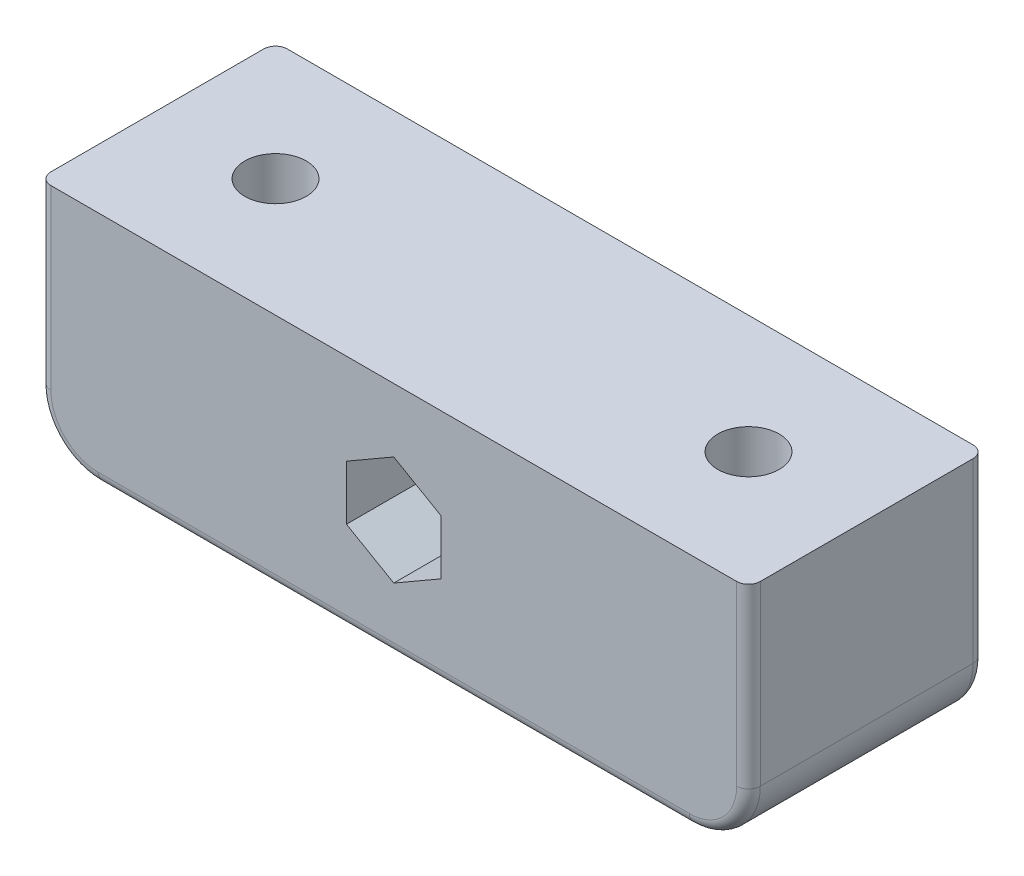
ISO-10303-21;
HEADER;
FILE_DESCRIPTION(('STEP AP214'),'2;1');
FILE_NAME('part.step','',(''),(''),'','','');
FILE_SCHEMA(('AUTOMOTIVE_DESIGN { 1 0 10303 214 1 1 1 1 }'));
ENDSEC;
DATA;
#1=APPLICATION_CONTEXT('core data for automotive mechanical design processes');
#2=APPLICATION_PROTOCOL_DEFINITION('international standard','automotive_design',2000,#1);
#3=PRODUCT_CONTEXT('',#1,'mechanical');
#4=PRODUCT('Part','Part','',(#3));
#5=PRODUCT_RELATED_PRODUCT_CATEGORY('part','',(#4));
#6=PRODUCT_DEFINITION_FORMATION('','',#4);
#7=PRODUCT_DEFINITION_CONTEXT('part definition',#1,'design');
#8=PRODUCT_DEFINITION('design','',#6,#7);
#9=PRODUCT_DEFINITION_SHAPE('','',#8);
#10=(LENGTH_UNIT() NAMED_UNIT(*) SI_UNIT(.MILLI.,.METRE.));
#11=(NAMED_UNIT(*) PLANE_ANGLE_UNIT() SI_UNIT($,.RADIAN.));
#12=(NAMED_UNIT(*) SI_UNIT($,.STERADIAN.) SOLID_ANGLE_UNIT());
#13=UNCERTAINTY_MEASURE_WITH_UNIT(LENGTH_MEASURE(1.E-05),#10,'distance_accuracy_value','');
#14=(GEOMETRIC_REPRESENTATION_CONTEXT(3) GLOBAL_UNCERTAINTY_ASSIGNED_CONTEXT((#13)) GLOBAL_UNIT_ASSIGNED_CONTEXT((#10,
#11,#12)) REPRESENTATION_CONTEXT('',''));
#15=CARTESIAN_POINT('',(0.,0.,0.));
#16=DIRECTION('',(0.,0.,1.));
#17=DIRECTION('',(1.,0.,0.));
#18=AXIS2_PLACEMENT_3D('',#15,#16,#17);
#19=CARTESIAN_POINT('',(0.,-10.,20.));
#20=DIRECTION('',(0.,0.,-1.));
#21=DIRECTION('',(-1.,0.,0.));
#22=AXIS2_PLACEMENT_3D('',#19,#20,#21);
#23=CYLINDRICAL_SURFACE('',#22,2.6);
#24=CARTESIAN_POINT('',(0.,-10.,3.));
#25=DIRECTION('',(0.,0.,-1.));
#26=DIRECTION('',(-1.,0.,0.));
#27=AXIS2_PLACEMENT_3D('',#24,#25,#26);
#28=CIRCLE('',#27,2.6);
#29=CARTESIAN_POINT('',(-2.6,-10.,3.));
#30=VERTEX_POINT('',#29);
#31=EDGE_CURVE('E295',#30,#30,#28,.T.);
#32=ORIENTED_EDGE('',*,*,#31,.T.);
#33=EDGE_LOOP('',(#32));
#34=FACE_BOUND('',#33,.T.);
#35=CARTESIAN_POINT('',(0.,-10.,12.));
#36=DIRECTION('',(0.,0.,1.));
#37=DIRECTION('',(1.,0.,0.));
#38=AXIS2_PLACEMENT_3D('',#35,#36,#37);
#39=CIRCLE('',#38,2.6);
#40=CARTESIAN_POINT('',(2.6,-10.,12.));
#41=VERTEX_POINT('',#40);
#42=EDGE_CURVE('E249',#41,#41,#39,.T.);
#43=ORIENTED_EDGE('',*,*,#42,.T.);
#44=EDGE_LOOP('',(#43));
#45=FACE_BOUND('',#44,.T.);
#46=ADVANCED_FACE('F33',(#34,#45),#23,.F.);
#47=CARTESIAN_POINT('',(-25.,-15.,20.));
#48=DIRECTION('',(0.,0.,-1.));
#49=DIRECTION('',(-1.,0.,0.));
#50=AXIS2_PLACEMENT_3D('',#47,#48,#49);
#51=PLANE('',#50);
#52=DIRECTION('',(-1.,0.,0.));
#53=VECTOR('',#52,1.);
#54=CARTESIAN_POINT('',(-30.,0.,20.));
#55=LINE('',#54,#53);
#56=CARTESIAN_POINT('',(29.,0.,20.));
#57=VERTEX_POINT('',#56);
#58=CARTESIAN_POINT('',(-29.,0.,20.));
#59=VERTEX_POINT('',#58);
#60=EDGE_CURVE('E319',#57,#59,#55,.T.);
#61=ORIENTED_EDGE('',*,*,#60,.T.);
#62=DIRECTION('',(0.,-1.,0.));
#63=VECTOR('',#62,1.);
#64=CARTESIAN_POINT('',(-29.,-15.,20.));
#65=LINE('',#64,#63);
#66=CARTESIAN_POINT('',(-29.,-15.,20.));
#67=VERTEX_POINT('',#66);
#68=EDGE_CURVE('E388',#59,#67,#65,.T.);
#69=ORIENTED_EDGE('',*,*,#68,.T.);
#70=CARTESIAN_POINT('',(-25.,-15.,20.));
#71=DIRECTION('',(0.,0.,-1.));
#72=DIRECTION('',(-1.,0.,0.));
#73=AXIS2_PLACEMENT_3D('',#70,#71,#72);
#74=CIRCLE('',#73,4.);
#75=CARTESIAN_POINT('',(-25.,-19.,20.));
#76=VERTEX_POINT('',#75);
#77=EDGE_CURVE('E57',#67,#76,#74,.F.);
#78=ORIENTED_EDGE('',*,*,#77,.T.);
#79=DIRECTION('',(1.,0.,0.));
#80=VECTOR('',#79,1.);
#81=CARTESIAN_POINT('',(-25.,-19.,20.));
#82=LINE('',#81,#80);
#83=CARTESIAN_POINT('',(25.,-19.,20.));
#84=VERTEX_POINT('',#83);
#85=EDGE_CURVE('E385',#76,#84,#82,.T.);
#86=ORIENTED_EDGE('',*,*,#85,.T.);
#87=CARTESIAN_POINT('',(25.,-15.,20.));
#88=DIRECTION('',(0.,0.,-1.));
#89=DIRECTION('',(-1.,0.,0.));
#90=AXIS2_PLACEMENT_3D('',#87,#88,#89);
#91=CIRCLE('',#90,4.);
#92=CARTESIAN_POINT('',(29.,-15.,20.));
#93=VERTEX_POINT('',#92);
#94=EDGE_CURVE('E381',#84,#93,#91,.F.);
#95=ORIENTED_EDGE('',*,*,#94,.T.);
#96=DIRECTION('',(0.,1.,0.));
#97=VECTOR('',#96,1.);
#98=CARTESIAN_POINT('',(29.,-15.,20.));
#99=LINE('',#98,#97);
#100=EDGE_CURVE('E383',#93,#57,#99,.T.);
#101=ORIENTED_EDGE('',*,*,#100,.T.);
#102=EDGE_LOOP('',(#61,#69,#78,#86,#95,#101));
#103=FACE_BOUND('',#102,.T.);
#104=DIRECTION('',(0.,-1.,0.));
#105=VECTOR('',#104,1.);
#106=CARTESIAN_POINT('',(-4.,-7.6905989232415,20.));
#107=LINE('',#106,#105);
#108=CARTESIAN_POINT('',(-4.,-7.6905989232415,20.));
#109=VERTEX_POINT('',#108);
#110=CARTESIAN_POINT('',(-4.,-12.3094010767585,20.));
#111=VERTEX_POINT('',#110);
#112=EDGE_CURVE('E236',#109,#111,#107,.T.);
#113=ORIENTED_EDGE('',*,*,#112,.F.);
#114=DIRECTION('',(-0.866025403784439,-0.5,0.));
#115=VECTOR('',#114,1.);
#116=CARTESIAN_POINT('',(0.,-5.38119784648299,20.));
#117=LINE('',#116,#115);
#118=CARTESIAN_POINT('',(0.,-5.38119784648299,20.));
#119=VERTEX_POINT('',#118);
#120=EDGE_CURVE('E204',#119,#109,#117,.T.);
#121=ORIENTED_EDGE('',*,*,#120,.F.);
#122=DIRECTION('',(-0.866025403784439,0.5,0.));
#123=VECTOR('',#122,1.);
#124=CARTESIAN_POINT('',(4.00000000000001,-7.6905989232415,20.));
#125=LINE('',#124,#123);
#126=CARTESIAN_POINT('',(4.00000000000001,-7.6905989232415,20.));
#127=VERTEX_POINT('',#126);
#128=EDGE_CURVE('E222',#127,#119,#125,.T.);
#129=ORIENTED_EDGE('',*,*,#128,.F.);
#130=DIRECTION('',(0.,1.,0.));
#131=VECTOR('',#130,1.);
#132=CARTESIAN_POINT('',(4.00000000000001,-12.3094010767585,20.));
#133=LINE('',#132,#131);
#134=CARTESIAN_POINT('',(4.00000000000001,-12.3094010767585,20.));
#135=VERTEX_POINT('',#134);
#136=EDGE_CURVE('E225',#135,#127,#133,.T.);
#137=ORIENTED_EDGE('',*,*,#136,.F.);
#138=DIRECTION('',(0.866025403784438,0.5,0.));
#139=VECTOR('',#138,1.);
#140=CARTESIAN_POINT('',(0.,-14.618802153517,20.));
#141=LINE('',#140,#139);
#142=CARTESIAN_POINT('',(0.,-14.618802153517,20.));
#143=VERTEX_POINT('',#142);
#144=EDGE_CURVE('E242',#143,#135,#141,.T.);
#145=ORIENTED_EDGE('',*,*,#144,.F.);
#146=DIRECTION('',(0.866025403784439,-0.5,0.));
#147=VECTOR('',#146,1.);
#148=CARTESIAN_POINT('',(-4.,-12.3094010767585,20.));
#149=LINE('',#148,#147);
#150=EDGE_CURVE('E239',#111,#143,#149,.T.);
#151=ORIENTED_EDGE('',*,*,#150,.F.);
#152=EDGE_LOOP('',(#113,#121,#129,#137,#145,#151));
#153=FACE_BOUND('',#152,.T.);
#154=ADVANCED_FACE('F420',(#103,#153),#51,.F.);
#155=CARTESIAN_POINT('',(-25.,-15.,0.));
#156=DIRECTION('',(0.,0.,-1.));
#157=DIRECTION('',(-1.,0.,0.));
#158=AXIS2_PLACEMENT_3D('',#155,#156,#157);
#159=PLANE('',#158);
#160=DIRECTION('',(-0.499999999999999,0.866025403784439,0.));
#161=VECTOR('',#160,1.);
#162=CARTESIAN_POINT('',(-3.03108891324554,-15.25,0.));
#163=LINE('',#162,#161);
#164=CARTESIAN_POINT('',(-3.03108891324554,-15.25,0.));
#165=VERTEX_POINT('',#164);
#166=CARTESIAN_POINT('',(-6.06217782649106,-9.99999999999999,0.));
#167=VERTEX_POINT('',#166);
#168=EDGE_CURVE('E277',#165,#167,#163,.T.);
#169=ORIENTED_EDGE('',*,*,#168,.F.);
#170=DIRECTION('',(-1.,0.,0.));
#171=VECTOR('',#170,1.);
#172=CARTESIAN_POINT('',(3.03108891324553,-15.25,0.));
#173=LINE('',#172,#171);
#174=CARTESIAN_POINT('',(3.03108891324553,-15.25,0.));
#175=VERTEX_POINT('',#174);
#176=EDGE_CURVE('E261',#175,#165,#173,.T.);
#177=ORIENTED_EDGE('',*,*,#176,.F.);
#178=DIRECTION('',(-0.5,-0.866025403784438,0.));
#179=VECTOR('',#178,1.);
#180=CARTESIAN_POINT('',(6.06217782649107,-10.,0.));
#181=LINE('',#180,#179);
#182=CARTESIAN_POINT('',(6.06217782649107,-10.,0.));
#183=VERTEX_POINT('',#182);
#184=EDGE_CURVE('E288',#183,#175,#181,.T.);
#185=ORIENTED_EDGE('',*,*,#184,.F.);
#186=DIRECTION('',(0.499999999999999,-0.866025403784439,0.));
#187=VECTOR('',#186,1.);
#188=CARTESIAN_POINT('',(3.03108891324554,-4.75,0.));
#189=LINE('',#188,#187);
#190=CARTESIAN_POINT('',(3.03108891324554,-4.75,0.));
#191=VERTEX_POINT('',#190);
#192=EDGE_CURVE('E285',#191,#183,#189,.T.);
#193=ORIENTED_EDGE('',*,*,#192,.F.);
#194=DIRECTION('',(1.,0.,0.));
#195=VECTOR('',#194,1.);
#196=CARTESIAN_POINT('',(-3.03108891324553,-4.75,0.));
#197=LINE('',#196,#195);
#198=CARTESIAN_POINT('',(-3.03108891324553,-4.75,0.));
#199=VERTEX_POINT('',#198);
#200=EDGE_CURVE('E282',#199,#191,#197,.T.);
#201=ORIENTED_EDGE('',*,*,#200,.F.);
#202=DIRECTION('',(0.5,0.866025403784438,0.));
#203=VECTOR('',#202,1.);
#204=CARTESIAN_POINT('',(-6.06217782649107,-9.99999999999999,0.));
#205=LINE('',#204,#203);
#206=EDGE_CURVE('E279',#167,#199,#205,.T.);
#207=ORIENTED_EDGE('',*,*,#206,.F.);
#208=EDGE_LOOP('',(#169,#177,#185,#193,#201,#207));
#209=FACE_BOUND('',#208,.T.);
#210=CARTESIAN_POINT('',(-25.,-15.,0.));
#211=DIRECTION('',(0.,0.,-1.));
#212=DIRECTION('',(-1.,0.,0.));
#213=AXIS2_PLACEMENT_3D('',#210,#211,#212);
#214=CIRCLE('',#213,4.);
#215=CARTESIAN_POINT('',(-25.,-19.,0.));
#216=VERTEX_POINT('',#215);
#217=CARTESIAN_POINT('',(-29.,-15.,0.));
#218=VERTEX_POINT('',#217);
#219=EDGE_CURVE('E357',#216,#218,#214,.T.);
#220=ORIENTED_EDGE('',*,*,#219,.T.);
#221=DIRECTION('',(0.,-1.,0.));
#222=VECTOR('',#221,1.);
#223=CARTESIAN_POINT('',(-29.,0.,0.));
#224=LINE('',#223,#222);
#225=CARTESIAN_POINT('',(-29.,0.,0.));
#226=VERTEX_POINT('',#225);
#227=EDGE_CURVE('E359',#218,#226,#224,.F.);
#228=ORIENTED_EDGE('',*,*,#227,.T.);
#229=DIRECTION('',(-1.,0.,0.));
#230=VECTOR('',#229,1.);
#231=CARTESIAN_POINT('',(-30.,0.,0.));
#232=LINE('',#231,#230);
#233=CARTESIAN_POINT('',(29.,0.,0.));
#234=VERTEX_POINT('',#233);
#235=EDGE_CURVE('E318',#234,#226,#232,.T.);
#236=ORIENTED_EDGE('',*,*,#235,.F.);
#237=DIRECTION('',(0.,1.,0.));
#238=VECTOR('',#237,1.);
#239=CARTESIAN_POINT('',(29.,-15.,0.));
#240=LINE('',#239,#238);
#241=CARTESIAN_POINT('',(29.,-15.,0.));
#242=VERTEX_POINT('',#241);
#243=EDGE_CURVE('E353',#234,#242,#240,.F.);
#244=ORIENTED_EDGE('',*,*,#243,.T.);
#245=CARTESIAN_POINT('',(25.,-15.,0.));
#246=DIRECTION('',(0.,0.,-1.));
#247=DIRECTION('',(-1.,0.,0.));
#248=AXIS2_PLACEMENT_3D('',#245,#246,#247);
#249=CIRCLE('',#248,4.);
#250=CARTESIAN_POINT('',(25.,-19.,0.));
#251=VERTEX_POINT('',#250);
#252=EDGE_CURVE('E351',#242,#251,#249,.T.);
#253=ORIENTED_EDGE('',*,*,#252,.T.);
#254=DIRECTION('',(1.,0.,0.));
#255=VECTOR('',#254,1.);
#256=CARTESIAN_POINT('',(-25.,-19.,0.));
#257=LINE('',#256,#255);
#258=EDGE_CURVE('E355',#251,#216,#257,.F.);
#259=ORIENTED_EDGE('',*,*,#258,.T.);
#260=EDGE_LOOP('',(#220,#228,#236,#244,#253,#259));
#261=FACE_BOUND('',#260,.T.);
#262=ADVANCED_FACE('F456',(#209,#261),#159,.T.);
#263=CARTESIAN_POINT('',(-30.,0.,20.));
#264=DIRECTION('',(1.,0.,0.));
#265=DIRECTION('',(0.,1.,0.));
#266=AXIS2_PLACEMENT_3D('',#263,#264,#265);
#267=PLANE('',#266);
#268=DIRECTION('',(0.,0.,-1.));
#269=VECTOR('',#268,1.);
#270=CARTESIAN_POINT('',(-30.,0.,20.));
#271=LINE('',#270,#269);
#272=CARTESIAN_POINT('',(-30.,0.,19.));
#273=VERTEX_POINT('',#272);
#274=CARTESIAN_POINT('',(-30.,0.,1.));
#275=VERTEX_POINT('',#274);
#276=EDGE_CURVE('E322',#273,#275,#271,.T.);
#277=ORIENTED_EDGE('',*,*,#276,.T.);
#278=DIRECTION('',(0.,-1.,0.));
#279=VECTOR('',#278,1.);
#280=CARTESIAN_POINT('',(-30.,-15.,1.));
#281=LINE('',#280,#279);
#282=CARTESIAN_POINT('',(-30.,-15.,1.));
#283=VERTEX_POINT('',#282);
#284=EDGE_CURVE('E348',#275,#283,#281,.T.);
#285=ORIENTED_EDGE('',*,*,#284,.T.);
#286=DIRECTION('',(0.,0.,-1.));
#287=VECTOR('',#286,1.);
#288=CARTESIAN_POINT('',(-30.,-15.,20.));
#289=LINE('',#288,#287);
#290=CARTESIAN_POINT('',(-30.,-15.,19.));
#291=VERTEX_POINT('',#290);
#292=EDGE_CURVE('E339',#291,#283,#289,.T.);
#293=ORIENTED_EDGE('',*,*,#292,.F.);
#294=DIRECTION('',(0.,-1.,0.));
#295=VECTOR('',#294,1.);
#296=CARTESIAN_POINT('',(-30.,0.,19.));
#297=LINE('',#296,#295);
#298=EDGE_CURVE('E342',#291,#273,#297,.F.);
#299=ORIENTED_EDGE('',*,*,#298,.T.);
#300=EDGE_LOOP('',(#277,#285,#293,#299));
#301=FACE_BOUND('',#300,.T.);
#302=ADVANCED_FACE('F449',(#301),#267,.F.);
#303=CARTESIAN_POINT('',(-25.,-15.,20.));
#304=DIRECTION('',(0.,0.,-1.));
#305=DIRECTION('',(-1.,0.,0.));
#306=AXIS2_PLACEMENT_3D('',#303,#304,#305);
#307=CYLINDRICAL_SURFACE('',#306,5.);
#308=ORIENTED_EDGE('',*,*,#292,.T.);
#309=CARTESIAN_POINT('',(-25.,-15.,1.));
#310=DIRECTION('',(0.,0.,-1.));
#311=DIRECTION('',(-1.,0.,0.));
#312=AXIS2_PLACEMENT_3D('',#309,#310,#311);
#313=CIRCLE('',#312,5.);
#314=CARTESIAN_POINT('',(-25.,-20.,1.));
#315=VERTEX_POINT('',#314);
#316=EDGE_CURVE('E371',#283,#315,#313,.F.);
#317=ORIENTED_EDGE('',*,*,#316,.T.);
#318=DIRECTION('',(0.,0.,-1.));
#319=VECTOR('',#318,1.);
#320=CARTESIAN_POINT('',(-25.,-20.,20.));
#321=LINE('',#320,#319);
#322=CARTESIAN_POINT('',(-25.,-20.,19.));
#323=VERTEX_POINT('',#322);
#324=EDGE_CURVE('E336',#323,#315,#321,.T.);
#325=ORIENTED_EDGE('',*,*,#324,.F.);
#326=CARTESIAN_POINT('',(-25.,-15.,19.));
#327=DIRECTION('',(0.,0.,-1.));
#328=DIRECTION('',(-1.,0.,0.));
#329=AXIS2_PLACEMENT_3D('',#326,#327,#328);
#330=CIRCLE('',#329,5.);
#331=EDGE_CURVE('E369',#323,#291,#330,.T.);
#332=ORIENTED_EDGE('',*,*,#331,.T.);
#333=EDGE_LOOP('',(#308,#317,#325,#332));
#334=FACE_BOUND('',#333,.T.);
#335=ADVANCED_FACE('F441',(#334),#307,.T.);
#336=CARTESIAN_POINT('',(-25.,-20.,20.));
#337=DIRECTION('',(0.,1.,0.));
#338=DIRECTION('',(-1.,0.,0.));
#339=AXIS2_PLACEMENT_3D('',#336,#337,#338);
#340=PLANE('',#339);
#341=CARTESIAN_POINT('',(20.,-20.,10.));
#342=DIRECTION('',(0.,1.,0.));
#343=DIRECTION('',(-1.,0.,0.));
#344=AXIS2_PLACEMENT_3D('',#341,#342,#343);
#345=CIRCLE('',#344,2.6);
#346=CARTESIAN_POINT('',(17.4,-20.,10.));
#347=VERTEX_POINT('',#346);
#348=EDGE_CURVE('E309',#347,#347,#345,.F.);
#349=ORIENTED_EDGE('',*,*,#348,.F.);
#350=EDGE_LOOP('',(#349));
#351=FACE_BOUND('',#350,.T.);
#352=CARTESIAN_POINT('',(-20.,-20.,10.));
#353=DIRECTION('',(0.,1.,0.));
#354=DIRECTION('',(-1.,0.,0.));
#355=AXIS2_PLACEMENT_3D('',#352,#353,#354);
#356=CIRCLE('',#355,2.6);
#357=CARTESIAN_POINT('',(-22.6,-20.,10.));
#358=VERTEX_POINT('',#357);
#359=EDGE_CURVE('E315',#358,#358,#356,.F.);
#360=ORIENTED_EDGE('',*,*,#359,.F.);
#361=EDGE_LOOP('',(#360));
#362=FACE_BOUND('',#361,.T.);
#363=ORIENTED_EDGE('',*,*,#324,.T.);
#364=DIRECTION('',(1.,0.,0.));
#365=VECTOR('',#364,1.);
#366=CARTESIAN_POINT('',(25.,-20.,1.));
#367=LINE('',#366,#365);
#368=CARTESIAN_POINT('',(25.,-20.,1.));
#369=VERTEX_POINT('',#368);
#370=EDGE_CURVE('E375',#315,#369,#367,.T.);
#371=ORIENTED_EDGE('',*,*,#370,.T.);
#372=DIRECTION('',(0.,0.,-1.));
#373=VECTOR('',#372,1.);
#374=CARTESIAN_POINT('',(25.,-20.,20.));
#375=LINE('',#374,#373);
#376=CARTESIAN_POINT('',(25.,-20.,19.));
#377=VERTEX_POINT('',#376);
#378=EDGE_CURVE('E333',#377,#369,#375,.T.);
#379=ORIENTED_EDGE('',*,*,#378,.F.);
#380=DIRECTION('',(1.,0.,0.));
#381=VECTOR('',#380,1.);
#382=CARTESIAN_POINT('',(-25.,-20.,19.));
#383=LINE('',#382,#381);
#384=EDGE_CURVE('E373',#377,#323,#383,.F.);
#385=ORIENTED_EDGE('',*,*,#384,.T.);
#386=EDGE_LOOP('',(#363,#371,#379,#385));
#387=FACE_BOUND('',#386,.T.);
#388=ADVANCED_FACE('F438',(#351,#362,#387),#340,.F.);
#389=CARTESIAN_POINT('',(25.,-15.,20.));
#390=DIRECTION('',(0.,0.,-1.));
#391=DIRECTION('',(-1.,0.,0.));
#392=AXIS2_PLACEMENT_3D('',#389,#390,#391);
#393=CYLINDRICAL_SURFACE('',#392,5.);
#394=ORIENTED_EDGE('',*,*,#378,.T.);
#395=CARTESIAN_POINT('',(25.,-15.,1.));
#396=DIRECTION('',(0.,0.,-1.));
#397=DIRECTION('',(-1.,0.,0.));
#398=AXIS2_PLACEMENT_3D('',#395,#396,#397);
#399=CIRCLE('',#398,5.);
#400=CARTESIAN_POINT('',(30.,-15.,1.));
#401=VERTEX_POINT('',#400);
#402=EDGE_CURVE('E11',#369,#401,#399,.F.);
#403=ORIENTED_EDGE('',*,*,#402,.T.);
#404=DIRECTION('',(0.,0.,-1.));
#405=VECTOR('',#404,1.);
#406=CARTESIAN_POINT('',(30.,-15.,20.));
#407=LINE('',#406,#405);
#408=CARTESIAN_POINT('',(30.,-15.,19.));
#409=VERTEX_POINT('',#408);
#410=EDGE_CURVE('E330',#409,#401,#407,.T.);
#411=ORIENTED_EDGE('',*,*,#410,.F.);
#412=CARTESIAN_POINT('',(25.,-15.,19.));
#413=DIRECTION('',(0.,0.,-1.));
#414=DIRECTION('',(-1.,0.,0.));
#415=AXIS2_PLACEMENT_3D('',#412,#413,#414);
#416=CIRCLE('',#415,5.);
#417=EDGE_CURVE('E42',#409,#377,#416,.T.);
#418=ORIENTED_EDGE('',*,*,#417,.T.);
#419=EDGE_LOOP('',(#394,#403,#411,#418));
#420=FACE_BOUND('',#419,.T.);
#421=ADVANCED_FACE('F472',(#420),#393,.T.);
#422=CARTESIAN_POINT('',(30.,0.,20.));
#423=DIRECTION('',(-1.,0.,0.));
#424=DIRECTION('',(0.,-1.,0.));
#425=AXIS2_PLACEMENT_3D('',#422,#423,#424);
#426=PLANE('',#425);
#427=ORIENTED_EDGE('',*,*,#410,.T.);
#428=DIRECTION('',(0.,1.,0.));
#429=VECTOR('',#428,1.);
#430=CARTESIAN_POINT('',(30.,0.,1.));
#431=LINE('',#430,#429);
#432=CARTESIAN_POINT('',(30.,0.,1.));
#433=VERTEX_POINT('',#432);
#434=EDGE_CURVE('E379',#401,#433,#431,.T.);
#435=ORIENTED_EDGE('',*,*,#434,.T.);
#436=DIRECTION('',(0.,0.,-1.));
#437=VECTOR('',#436,1.);
#438=CARTESIAN_POINT('',(30.,0.,20.));
#439=LINE('',#438,#437);
#440=CARTESIAN_POINT('',(30.,0.,19.));
#441=VERTEX_POINT('',#440);
#442=EDGE_CURVE('E327',#441,#433,#439,.T.);
#443=ORIENTED_EDGE('',*,*,#442,.F.);
#444=DIRECTION('',(0.,1.,0.));
#445=VECTOR('',#444,1.);
#446=CARTESIAN_POINT('',(30.,0.,19.));
#447=LINE('',#446,#445);
#448=EDGE_CURVE('E377',#441,#409,#447,.F.);
#449=ORIENTED_EDGE('',*,*,#448,.T.);
#450=EDGE_LOOP('',(#427,#435,#443,#449));
#451=FACE_BOUND('',#450,.T.);
#452=ADVANCED_FACE('F475',(#451),#426,.F.);
#453=CARTESIAN_POINT('',(-30.,0.,20.));
#454=DIRECTION('',(0.,-1.,0.));
#455=DIRECTION('',(1.,0.,0.));
#456=AXIS2_PLACEMENT_3D('',#453,#454,#455);
#457=PLANE('',#456);
#458=CARTESIAN_POINT('',(20.,0.,10.));
#459=DIRECTION('',(0.,1.,0.));
#460=DIRECTION('',(1.,0.,0.));
#461=AXIS2_PLACEMENT_3D('',#458,#459,#460);
#462=CIRCLE('',#461,2.6);
#463=CARTESIAN_POINT('',(22.6,0.,10.));
#464=VERTEX_POINT('',#463);
#465=EDGE_CURVE('E306',#464,#464,#462,.T.);
#466=ORIENTED_EDGE('',*,*,#465,.F.);
#467=EDGE_LOOP('',(#466));
#468=FACE_BOUND('',#467,.T.);
#469=CARTESIAN_POINT('',(-20.,0.,10.));
#470=DIRECTION('',(0.,1.,0.));
#471=DIRECTION('',(-1.,0.,0.));
#472=AXIS2_PLACEMENT_3D('',#469,#470,#471);
#473=CIRCLE('',#472,2.6);
#474=CARTESIAN_POINT('',(-22.6,0.,10.));
#475=VERTEX_POINT('',#474);
#476=EDGE_CURVE('E312',#475,#475,#473,.T.);
#477=ORIENTED_EDGE('',*,*,#476,.F.);
#478=EDGE_LOOP('',(#477));
#479=FACE_BOUND('',#478,.T.);
#480=ORIENTED_EDGE('',*,*,#235,.T.);
#481=CARTESIAN_POINT('',(-29.,0.,1.));
#482=DIRECTION('',(0.,-1.,0.));
#483=DIRECTION('',(1.,0.,0.));
#484=AXIS2_PLACEMENT_3D('',#481,#482,#483);
#485=CIRCLE('',#484,1.);
#486=EDGE_CURVE('E367',#226,#275,#485,.F.);
#487=ORIENTED_EDGE('',*,*,#486,.T.);
#488=ORIENTED_EDGE('',*,*,#276,.F.);
#489=CARTESIAN_POINT('',(-29.,0.,19.));
#490=DIRECTION('',(0.,-1.,0.));
#491=DIRECTION('',(1.,0.,0.));
#492=AXIS2_PLACEMENT_3D('',#489,#490,#491);
#493=CIRCLE('',#492,1.);
#494=EDGE_CURVE('E363',#273,#59,#493,.F.);
#495=ORIENTED_EDGE('',*,*,#494,.T.);
#496=ORIENTED_EDGE('',*,*,#60,.F.);
#497=CARTESIAN_POINT('',(29.,0.,19.));
#498=DIRECTION('',(0.,-1.,0.));
#499=DIRECTION('',(1.,0.,0.));
#500=AXIS2_PLACEMENT_3D('',#497,#498,#499);
#501=CIRCLE('',#500,1.);
#502=EDGE_CURVE('E361',#57,#441,#501,.F.);
#503=ORIENTED_EDGE('',*,*,#502,.T.);
#504=ORIENTED_EDGE('',*,*,#442,.T.);
#505=CARTESIAN_POINT('',(29.,0.,1.));
#506=DIRECTION('',(0.,-1.,0.));
#507=DIRECTION('',(1.,0.,0.));
#508=AXIS2_PLACEMENT_3D('',#505,#506,#507);
#509=CIRCLE('',#508,1.);
#510=EDGE_CURVE('E365',#433,#234,#509,.F.);
#511=ORIENTED_EDGE('',*,*,#510,.T.);
#512=EDGE_LOOP('',(#480,#487,#488,#495,#496,#503,#504,#511));
#513=FACE_BOUND('',#512,.T.);
#514=ADVANCED_FACE('F423',(#468,#479,#513),#457,.F.);
#515=CARTESIAN_POINT('',(-20.,-27.3539105243401,10.));
#516=DIRECTION('',(0.,1.,0.));
#517=DIRECTION('',(-1.,0.,0.));
#518=AXIS2_PLACEMENT_3D('',#515,#516,#517);
#519=CYLINDRICAL_SURFACE('',#518,2.6);
#520=ORIENTED_EDGE('',*,*,#359,.T.);
#521=EDGE_LOOP('',(#520));
#522=FACE_BOUND('',#521,.T.);
#523=ORIENTED_EDGE('',*,*,#476,.T.);
#524=EDGE_LOOP('',(#523));
#525=FACE_BOUND('',#524,.T.);
#526=ADVANCED_FACE('F482',(#522,#525),#519,.F.);
#527=CARTESIAN_POINT('',(20.,-27.3539105243401,10.));
#528=DIRECTION('',(0.,1.,0.));
#529=DIRECTION('',(-1.,0.,0.));
#530=AXIS2_PLACEMENT_3D('',#527,#528,#529);
#531=CYLINDRICAL_SURFACE('',#530,2.6);
#532=ORIENTED_EDGE('',*,*,#348,.T.);
#533=EDGE_LOOP('',(#532));
#534=FACE_BOUND('',#533,.T.);
#535=ORIENTED_EDGE('',*,*,#465,.T.);
#536=EDGE_LOOP('',(#535));
#537=FACE_BOUND('',#536,.T.);
#538=ADVANCED_FACE('F540',(#534,#537),#531,.F.);
#539=CARTESIAN_POINT('',(-3.03108891324554,-15.25,3.));
#540=DIRECTION('',(-0.866025403784439,-0.499999999999999,0.));
#541=DIRECTION('',(0.499999999999999,-0.866025403784439,0.));
#542=AXIS2_PLACEMENT_3D('',#539,#540,#541);
#543=PLANE('',#542);
#544=ORIENTED_EDGE('',*,*,#168,.T.);
#545=DIRECTION('',(0.,0.,-1.));
#546=VECTOR('',#545,1.);
#547=CARTESIAN_POINT('',(-6.06217782649107,-9.99999999999999,3.));
#548=LINE('',#547,#546);
#549=CARTESIAN_POINT('',(-6.06217782649107,-9.99999999999999,3.));
#550=VERTEX_POINT('',#549);
#551=EDGE_CURVE('E276',#550,#167,#548,.T.);
#552=ORIENTED_EDGE('',*,*,#551,.F.);
#553=DIRECTION('',(-0.499999999999999,0.866025403784439,0.));
#554=VECTOR('',#553,1.);
#555=CARTESIAN_POINT('',(-3.03108891324554,-15.25,3.));
#556=LINE('',#555,#554);
#557=CARTESIAN_POINT('',(-3.03108891324554,-15.25,3.));
#558=VERTEX_POINT('',#557);
#559=EDGE_CURVE('E257',#558,#550,#556,.T.);
#560=ORIENTED_EDGE('',*,*,#559,.F.);
#561=DIRECTION('',(0.,0.,-1.));
#562=VECTOR('',#561,1.);
#563=CARTESIAN_POINT('',(-3.03108891324554,-15.25,3.));
#564=LINE('',#563,#562);
#565=EDGE_CURVE('E293',#558,#165,#564,.T.);
#566=ORIENTED_EDGE('',*,*,#565,.T.);
#567=EDGE_LOOP('',(#544,#552,#560,#566));
#568=FACE_BOUND('',#567,.T.);
#569=ADVANCED_FACE('F509',(#568),#543,.F.);
#570=CARTESIAN_POINT('',(3.03108891324553,-15.25,3.));
#571=DIRECTION('',(0.,-1.,0.));
#572=DIRECTION('',(1.,0.,0.));
#573=AXIS2_PLACEMENT_3D('',#570,#571,#572);
#574=PLANE('',#573);
#575=ORIENTED_EDGE('',*,*,#176,.T.);
#576=ORIENTED_EDGE('',*,*,#565,.F.);
#577=DIRECTION('',(-1.,0.,0.));
#578=VECTOR('',#577,1.);
#579=CARTESIAN_POINT('',(3.03108891324553,-15.25,3.));
#580=LINE('',#579,#578);
#581=CARTESIAN_POINT('',(3.03108891324553,-15.25,3.));
#582=VERTEX_POINT('',#581);
#583=EDGE_CURVE('E273',#582,#558,#580,.T.);
#584=ORIENTED_EDGE('',*,*,#583,.F.);
#585=DIRECTION('',(0.,0.,-1.));
#586=VECTOR('',#585,1.);
#587=CARTESIAN_POINT('',(3.03108891324553,-15.25,3.));
#588=LINE('',#587,#586);
#589=EDGE_CURVE('E296',#582,#175,#588,.T.);
#590=ORIENTED_EDGE('',*,*,#589,.T.);
#591=EDGE_LOOP('',(#575,#576,#584,#590));
#592=FACE_BOUND('',#591,.T.);
#593=ADVANCED_FACE('F520',(#592),#574,.F.);
#594=CARTESIAN_POINT('',(6.06217782649107,-10.,3.));
#595=DIRECTION('',(0.866025403784438,-0.5,0.));
#596=DIRECTION('',(0.5,0.866025403784439,0.));
#597=AXIS2_PLACEMENT_3D('',#594,#595,#596);
#598=PLANE('',#597);
#599=ORIENTED_EDGE('',*,*,#184,.T.);
#600=ORIENTED_EDGE('',*,*,#589,.F.);
#601=DIRECTION('',(-0.5,-0.866025403784438,0.));
#602=VECTOR('',#601,1.);
#603=CARTESIAN_POINT('',(6.06217782649107,-10.,3.));
#604=LINE('',#603,#602);
#605=CARTESIAN_POINT('',(6.06217782649107,-10.,3.));
#606=VERTEX_POINT('',#605);
#607=EDGE_CURVE('E270',#606,#582,#604,.T.);
#608=ORIENTED_EDGE('',*,*,#607,.F.);
#609=DIRECTION('',(0.,0.,-1.));
#610=VECTOR('',#609,1.);
#611=CARTESIAN_POINT('',(6.06217782649107,-10.,3.));
#612=LINE('',#611,#610);
#613=EDGE_CURVE('E298',#606,#183,#612,.T.);
#614=ORIENTED_EDGE('',*,*,#613,.T.);
#615=EDGE_LOOP('',(#599,#600,#608,#614));
#616=FACE_BOUND('',#615,.T.);
#617=ADVANCED_FACE('F522',(#616),#598,.F.);
#618=CARTESIAN_POINT('',(3.03108891324554,-4.75,3.));
#619=DIRECTION('',(0.866025403784439,0.499999999999999,0.));
#620=DIRECTION('',(-0.499999999999999,0.866025403784439,0.));
#621=AXIS2_PLACEMENT_3D('',#618,#619,#620);
#622=PLANE('',#621);
#623=ORIENTED_EDGE('',*,*,#192,.T.);
#624=ORIENTED_EDGE('',*,*,#613,.F.);
#625=DIRECTION('',(0.499999999999999,-0.866025403784439,0.));
#626=VECTOR('',#625,1.);
#627=CARTESIAN_POINT('',(3.03108891324554,-4.75,3.));
#628=LINE('',#627,#626);
#629=CARTESIAN_POINT('',(3.03108891324554,-4.75,3.));
#630=VERTEX_POINT('',#629);
#631=EDGE_CURVE('E267',#630,#606,#628,.T.);
#632=ORIENTED_EDGE('',*,*,#631,.F.);
#633=DIRECTION('',(0.,0.,-1.));
#634=VECTOR('',#633,1.);
#635=CARTESIAN_POINT('',(3.03108891324554,-4.75,3.));
#636=LINE('',#635,#634);
#637=EDGE_CURVE('E300',#630,#191,#636,.T.);
#638=ORIENTED_EDGE('',*,*,#637,.T.);
#639=EDGE_LOOP('',(#623,#624,#632,#638));
#640=FACE_BOUND('',#639,.T.);
#641=ADVANCED_FACE('F525',(#640),#622,.F.);
#642=CARTESIAN_POINT('',(-3.03108891324553,-4.75,3.));
#643=DIRECTION('',(0.,1.,0.));
#644=DIRECTION('',(-1.,0.,0.));
#645=AXIS2_PLACEMENT_3D('',#642,#643,#644);
#646=PLANE('',#645);
#647=ORIENTED_EDGE('',*,*,#200,.T.);
#648=ORIENTED_EDGE('',*,*,#637,.F.);
#649=DIRECTION('',(1.,0.,0.));
#650=VECTOR('',#649,1.);
#651=CARTESIAN_POINT('',(-3.03108891324553,-4.75,3.));
#652=LINE('',#651,#650);
#653=CARTESIAN_POINT('',(-3.03108891324553,-4.75,3.));
#654=VERTEX_POINT('',#653);
#655=EDGE_CURVE('E264',#654,#630,#652,.T.);
#656=ORIENTED_EDGE('',*,*,#655,.F.);
#657=DIRECTION('',(0.,0.,-1.));
#658=VECTOR('',#657,1.);
#659=CARTESIAN_POINT('',(-3.03108891324553,-4.75,3.));
#660=LINE('',#659,#658);
#661=EDGE_CURVE('E302',#654,#199,#660,.T.);
#662=ORIENTED_EDGE('',*,*,#661,.T.);
#663=EDGE_LOOP('',(#647,#648,#656,#662));
#664=FACE_BOUND('',#663,.T.);
#665=ADVANCED_FACE('F528',(#664),#646,.F.);
#666=CARTESIAN_POINT('',(-6.06217782649107,-9.99999999999999,3.));
#667=DIRECTION('',(-0.866025403784438,0.5,0.));
#668=DIRECTION('',(-0.5,-0.866025403784438,0.));
#669=AXIS2_PLACEMENT_3D('',#666,#667,#668);
#670=PLANE('',#669);
#671=ORIENTED_EDGE('',*,*,#206,.T.);
#672=ORIENTED_EDGE('',*,*,#661,.F.);
#673=DIRECTION('',(0.5,0.866025403784438,0.));
#674=VECTOR('',#673,1.);
#675=CARTESIAN_POINT('',(-6.06217782649107,-9.99999999999999,3.));
#676=LINE('',#675,#674);
#677=EDGE_CURVE('E260',#550,#654,#676,.T.);
#678=ORIENTED_EDGE('',*,*,#677,.F.);
#679=ORIENTED_EDGE('',*,*,#551,.T.);
#680=EDGE_LOOP('',(#671,#672,#678,#679));
#681=FACE_BOUND('',#680,.T.);
#682=ADVANCED_FACE('F513',(#681),#670,.F.);
#683=CARTESIAN_POINT('',(0.,0.,3.));
#684=DIRECTION('',(0.,0.,-1.));
#685=DIRECTION('',(-1.,0.,0.));
#686=AXIS2_PLACEMENT_3D('',#683,#684,#685);
#687=PLANE('',#686);
#688=ORIENTED_EDGE('',*,*,#31,.F.);
#689=EDGE_LOOP('',(#688));
#690=FACE_BOUND('',#689,.T.);
#691=ORIENTED_EDGE('',*,*,#559,.T.);
#692=ORIENTED_EDGE('',*,*,#677,.T.);
#693=ORIENTED_EDGE('',*,*,#655,.T.);
#694=ORIENTED_EDGE('',*,*,#631,.T.);
#695=ORIENTED_EDGE('',*,*,#607,.T.);
#696=ORIENTED_EDGE('',*,*,#583,.T.);
#697=EDGE_LOOP('',(#691,#692,#693,#694,#695,#696));
#698=FACE_BOUND('',#697,.T.);
#699=ADVANCED_FACE('F516',(#690,#698),#687,.T.);
#700=CARTESIAN_POINT('',(0.,-5.38119784648299,12.));
#701=DIRECTION('',(-0.5,0.866025403784439,0.));
#702=DIRECTION('',(-0.866025403784439,-0.5,0.));
#703=AXIS2_PLACEMENT_3D('',#700,#701,#702);
#704=PLANE('',#703);
#705=ORIENTED_EDGE('',*,*,#120,.T.);
#706=DIRECTION('',(0.,0.,1.));
#707=VECTOR('',#706,1.);
#708=CARTESIAN_POINT('',(-4.,-7.6905989232415,12.));
#709=LINE('',#708,#707);
#710=CARTESIAN_POINT('',(-4.,-7.6905989232415,12.));
#711=VERTEX_POINT('',#710);
#712=EDGE_CURVE('E197',#711,#109,#709,.T.);
#713=ORIENTED_EDGE('',*,*,#712,.F.);
#714=DIRECTION('',(-0.866025403784439,-0.5,0.));
#715=VECTOR('',#714,1.);
#716=CARTESIAN_POINT('',(0.,-5.38119784648299,12.));
#717=LINE('',#716,#715);
#718=CARTESIAN_POINT('',(0.,-5.38119784648299,12.));
#719=VERTEX_POINT('',#718);
#720=EDGE_CURVE('E201',#719,#711,#717,.T.);
#721=ORIENTED_EDGE('',*,*,#720,.F.);
#722=DIRECTION('',(0.,0.,1.));
#723=VECTOR('',#722,1.);
#724=CARTESIAN_POINT('',(0.,-5.38119784648299,12.));
#725=LINE('',#724,#723);
#726=EDGE_CURVE('E247',#719,#119,#725,.T.);
#727=ORIENTED_EDGE('',*,*,#726,.T.);
#728=EDGE_LOOP('',(#705,#713,#721,#727));
#729=FACE_BOUND('',#728,.T.);
#730=ADVANCED_FACE('F199',(#729),#704,.F.);
#731=CARTESIAN_POINT('',(4.00000000000001,-7.6905989232415,12.));
#732=DIRECTION('',(0.5,0.866025403784439,0.));
#733=DIRECTION('',(-0.866025403784439,0.5,0.));
#734=AXIS2_PLACEMENT_3D('',#731,#732,#733);
#735=PLANE('',#734);
#736=ORIENTED_EDGE('',*,*,#128,.T.);
#737=ORIENTED_EDGE('',*,*,#726,.F.);
#738=DIRECTION('',(-0.866025403784439,0.5,0.));
#739=VECTOR('',#738,1.);
#740=CARTESIAN_POINT('',(4.00000000000001,-7.6905989232415,12.));
#741=LINE('',#740,#739);
#742=CARTESIAN_POINT('',(4.00000000000001,-7.6905989232415,12.));
#743=VERTEX_POINT('',#742);
#744=EDGE_CURVE('E209',#743,#719,#741,.T.);
#745=ORIENTED_EDGE('',*,*,#744,.F.);
#746=DIRECTION('',(0.,0.,1.));
#747=VECTOR('',#746,1.);
#748=CARTESIAN_POINT('',(4.00000000000001,-7.6905989232415,12.));
#749=LINE('',#748,#747);
#750=EDGE_CURVE('E250',#743,#127,#749,.T.);
#751=ORIENTED_EDGE('',*,*,#750,.T.);
#752=EDGE_LOOP('',(#736,#737,#745,#751));
#753=FACE_BOUND('',#752,.T.);
#754=ADVANCED_FACE('F642',(#753),#735,.F.);
#755=CARTESIAN_POINT('',(4.00000000000001,-12.3094010767585,12.));
#756=DIRECTION('',(1.,0.,0.));
#757=DIRECTION('',(0.,1.,0.));
#758=AXIS2_PLACEMENT_3D('',#755,#756,#757);
#759=PLANE('',#758);
#760=ORIENTED_EDGE('',*,*,#136,.T.);
#761=ORIENTED_EDGE('',*,*,#750,.F.);
#762=DIRECTION('',(0.,1.,0.));
#763=VECTOR('',#762,1.);
#764=CARTESIAN_POINT('',(4.00000000000001,-12.3094010767585,12.));
#765=LINE('',#764,#763);
#766=CARTESIAN_POINT('',(4.00000000000001,-12.3094010767585,12.));
#767=VERTEX_POINT('',#766);
#768=EDGE_CURVE('E232',#767,#743,#765,.T.);
#769=ORIENTED_EDGE('',*,*,#768,.F.);
#770=DIRECTION('',(0.,0.,1.));
#771=VECTOR('',#770,1.);
#772=CARTESIAN_POINT('',(4.00000000000001,-12.3094010767585,12.));
#773=LINE('',#772,#771);
#774=EDGE_CURVE('E252',#767,#135,#773,.T.);
#775=ORIENTED_EDGE('',*,*,#774,.T.);
#776=EDGE_LOOP('',(#760,#761,#769,#775));
#777=FACE_BOUND('',#776,.T.);
#778=ADVANCED_FACE('F634',(#777),#759,.F.);
#779=CARTESIAN_POINT('',(0.,-14.618802153517,12.));
#780=DIRECTION('',(0.5,-0.866025403784438,0.));
#781=DIRECTION('',(0.866025403784438,0.5,0.));
#782=AXIS2_PLACEMENT_3D('',#779,#780,#781);
#783=PLANE('',#782);
#784=ORIENTED_EDGE('',*,*,#144,.T.);
#785=ORIENTED_EDGE('',*,*,#774,.F.);
#786=DIRECTION('',(0.866025403784438,0.5,0.));
#787=VECTOR('',#786,1.);
#788=CARTESIAN_POINT('',(0.,-14.618802153517,12.));
#789=LINE('',#788,#787);
#790=CARTESIAN_POINT('',(0.,-14.618802153517,12.));
#791=VERTEX_POINT('',#790);
#792=EDGE_CURVE('E229',#791,#767,#789,.T.);
#793=ORIENTED_EDGE('',*,*,#792,.F.);
#794=DIRECTION('',(0.,0.,1.));
#795=VECTOR('',#794,1.);
#796=CARTESIAN_POINT('',(0.,-14.618802153517,12.));
#797=LINE('',#796,#795);
#798=EDGE_CURVE('E254',#791,#143,#797,.T.);
#799=ORIENTED_EDGE('',*,*,#798,.T.);
#800=EDGE_LOOP('',(#784,#785,#793,#799));
#801=FACE_BOUND('',#800,.T.);
#802=ADVANCED_FACE('F626',(#801),#783,.F.);
#803=CARTESIAN_POINT('',(-4.,-12.3094010767585,12.));
#804=DIRECTION('',(-0.5,-0.866025403784439,0.));
#805=DIRECTION('',(0.866025403784439,-0.5,0.));
#806=AXIS2_PLACEMENT_3D('',#803,#804,#805);
#807=PLANE('',#806);
#808=ORIENTED_EDGE('',*,*,#150,.T.);
#809=ORIENTED_EDGE('',*,*,#798,.F.);
#810=DIRECTION('',(0.866025403784439,-0.5,0.));
#811=VECTOR('',#810,1.);
#812=CARTESIAN_POINT('',(-4.,-12.3094010767585,12.));
#813=LINE('',#812,#811);
#814=CARTESIAN_POINT('',(-4.,-12.3094010767585,12.));
#815=VERTEX_POINT('',#814);
#816=EDGE_CURVE('E217',#815,#791,#813,.T.);
#817=ORIENTED_EDGE('',*,*,#816,.F.);
#818=DIRECTION('',(0.,0.,1.));
#819=VECTOR('',#818,1.);
#820=CARTESIAN_POINT('',(-4.,-12.3094010767585,12.));
#821=LINE('',#820,#819);
#822=EDGE_CURVE('E208',#815,#111,#821,.T.);
#823=ORIENTED_EDGE('',*,*,#822,.T.);
#824=EDGE_LOOP('',(#808,#809,#817,#823));
#825=FACE_BOUND('',#824,.T.);
#826=ADVANCED_FACE('F619',(#825),#807,.F.);
#827=CARTESIAN_POINT('',(-4.,-7.6905989232415,12.));
#828=DIRECTION('',(-1.,0.,0.));
#829=DIRECTION('',(0.,0.,1.));
#830=AXIS2_PLACEMENT_3D('',#827,#828,#829);
#831=PLANE('',#830);
#832=ORIENTED_EDGE('',*,*,#112,.T.);
#833=ORIENTED_EDGE('',*,*,#822,.F.);
#834=DIRECTION('',(0.,-1.,0.));
#835=VECTOR('',#834,1.);
#836=CARTESIAN_POINT('',(-4.,-7.6905989232415,12.));
#837=LINE('',#836,#835);
#838=EDGE_CURVE('E212',#711,#815,#837,.T.);
#839=ORIENTED_EDGE('',*,*,#838,.F.);
#840=ORIENTED_EDGE('',*,*,#712,.T.);
#841=EDGE_LOOP('',(#832,#833,#839,#840));
#842=FACE_BOUND('',#841,.T.);
#843=ADVANCED_FACE('F213',(#842),#831,.F.);
#844=CARTESIAN_POINT('',(0.,0.,12.));
#845=DIRECTION('',(0.,0.,1.));
#846=DIRECTION('',(1.,0.,0.));
#847=AXIS2_PLACEMENT_3D('',#844,#845,#846);
#848=PLANE('',#847);
#849=ORIENTED_EDGE('',*,*,#42,.F.);
#850=EDGE_LOOP('',(#849));
#851=FACE_BOUND('',#850,.T.);
#852=ORIENTED_EDGE('',*,*,#720,.T.);
#853=ORIENTED_EDGE('',*,*,#838,.T.);
#854=ORIENTED_EDGE('',*,*,#816,.T.);
#855=ORIENTED_EDGE('',*,*,#792,.T.);
#856=ORIENTED_EDGE('',*,*,#768,.T.);
#857=ORIENTED_EDGE('',*,*,#744,.T.);
#858=EDGE_LOOP('',(#852,#853,#854,#855,#856,#857));
#859=FACE_BOUND('',#858,.T.);
#860=ADVANCED_FACE('F219',(#851,#859),#848,.T.);
#861=CARTESIAN_POINT('',(29.,0.,1.));
#862=DIRECTION('',(0.,-1.,0.));
#863=DIRECTION('',(1.,0.,0.));
#864=AXIS2_PLACEMENT_3D('',#861,#862,#863);
#865=CYLINDRICAL_SURFACE('',#864,1.);
#866=ORIENTED_EDGE('',*,*,#510,.F.);
#867=ORIENTED_EDGE('',*,*,#434,.F.);
#868=CARTESIAN_POINT('',(29.,-15.,1.));
#869=DIRECTION('',(0.,-1.,0.));
#870=DIRECTION('',(0.,0.,-1.));
#871=AXIS2_PLACEMENT_3D('',#868,#869,#870);
#872=CIRCLE('',#871,1.);
#873=EDGE_CURVE('E237',#242,#401,#872,.T.);
#874=ORIENTED_EDGE('',*,*,#873,.F.);
#875=ORIENTED_EDGE('',*,*,#243,.F.);
#876=EDGE_LOOP('',(#866,#867,#874,#875));
#877=FACE_BOUND('',#876,.T.);
#878=ADVANCED_FACE('F461',(#877),#865,.T.);
#879=CARTESIAN_POINT('',(25.,-15.,1.));
#880=DIRECTION('',(0.,0.,-1.));
#881=DIRECTION('',(-1.,0.,0.));
#882=AXIS2_PLACEMENT_3D('',#879,#880,#881);
#883=TOROIDAL_SURFACE('',#882,4.,1.);
#884=ORIENTED_EDGE('',*,*,#873,.T.);
#885=ORIENTED_EDGE('',*,*,#402,.F.);
#886=CARTESIAN_POINT('',(25.,-19.,1.));
#887=DIRECTION('',(-1.,0.,0.));
#888=DIRECTION('',(0.,0.,1.));
#889=AXIS2_PLACEMENT_3D('',#886,#887,#888);
#890=CIRCLE('',#889,1.);
#891=EDGE_CURVE('E396',#251,#369,#890,.T.);
#892=ORIENTED_EDGE('',*,*,#891,.F.);
#893=ORIENTED_EDGE('',*,*,#252,.F.);
#894=EDGE_LOOP('',(#884,#885,#892,#893));
#895=FACE_BOUND('',#894,.T.);
#896=ADVANCED_FACE('F468',(#895),#883,.T.);
#897=CARTESIAN_POINT('',(-25.,-19.,1.));
#898=DIRECTION('',(-1.,0.,0.));
#899=DIRECTION('',(0.,-1.,0.));
#900=AXIS2_PLACEMENT_3D('',#897,#898,#899);
#901=CYLINDRICAL_SURFACE('',#900,1.);
#902=ORIENTED_EDGE('',*,*,#891,.T.);
#903=ORIENTED_EDGE('',*,*,#370,.F.);
#904=CARTESIAN_POINT('',(-25.,-19.,1.));
#905=DIRECTION('',(-1.,0.,0.));
#906=DIRECTION('',(0.,-1.,0.));
#907=AXIS2_PLACEMENT_3D('',#904,#905,#906);
#908=CIRCLE('',#907,1.);
#909=EDGE_CURVE('E393',#216,#315,#908,.T.);
#910=ORIENTED_EDGE('',*,*,#909,.F.);
#911=ORIENTED_EDGE('',*,*,#258,.F.);
#912=EDGE_LOOP('',(#902,#903,#910,#911));
#913=FACE_BOUND('',#912,.T.);
#914=ADVANCED_FACE('F470',(#913),#901,.T.);
#915=CARTESIAN_POINT('',(-25.,-15.,1.));
#916=DIRECTION('',(0.,0.,-1.));
#917=DIRECTION('',(-1.,0.,0.));
#918=AXIS2_PLACEMENT_3D('',#915,#916,#917);
#919=TOROIDAL_SURFACE('',#918,4.,1.);
#920=ORIENTED_EDGE('',*,*,#909,.T.);
#921=ORIENTED_EDGE('',*,*,#316,.F.);
#922=CARTESIAN_POINT('',(-29.,-15.,1.));
#923=DIRECTION('',(0.,1.,0.));
#924=DIRECTION('',(0.,0.,1.));
#925=AXIS2_PLACEMENT_3D('',#922,#923,#924);
#926=CIRCLE('',#925,1.);
#927=EDGE_CURVE('E391',#218,#283,#926,.T.);
#928=ORIENTED_EDGE('',*,*,#927,.F.);
#929=ORIENTED_EDGE('',*,*,#219,.F.);
#930=EDGE_LOOP('',(#920,#921,#928,#929));
#931=FACE_BOUND('',#930,.T.);
#932=ADVANCED_FACE('F445',(#931),#919,.T.);
#933=CARTESIAN_POINT('',(-29.,0.,1.));
#934=DIRECTION('',(0.,1.,0.));
#935=DIRECTION('',(-1.,0.,0.));
#936=AXIS2_PLACEMENT_3D('',#933,#934,#935);
#937=CYLINDRICAL_SURFACE('',#936,1.);
#938=ORIENTED_EDGE('',*,*,#486,.F.);
#939=ORIENTED_EDGE('',*,*,#227,.F.);
#940=ORIENTED_EDGE('',*,*,#927,.T.);
#941=ORIENTED_EDGE('',*,*,#284,.F.);
#942=EDGE_LOOP('',(#938,#939,#940,#941));
#943=FACE_BOUND('',#942,.T.);
#944=ADVANCED_FACE('F452',(#943),#937,.T.);
#945=CARTESIAN_POINT('',(29.,-15.,19.));
#946=DIRECTION('',(0.,1.,0.));
#947=DIRECTION('',(-1.,0.,0.));
#948=AXIS2_PLACEMENT_3D('',#945,#946,#947);
#949=CYLINDRICAL_SURFACE('',#948,1.);
#950=ORIENTED_EDGE('',*,*,#502,.F.);
#951=ORIENTED_EDGE('',*,*,#100,.F.);
#952=CARTESIAN_POINT('',(29.,-15.,19.));
#953=DIRECTION('',(0.,-1.,0.));
#954=DIRECTION('',(0.,0.,-1.));
#955=AXIS2_PLACEMENT_3D('',#952,#953,#954);
#956=CIRCLE('',#955,1.);
#957=EDGE_CURVE('E37',#409,#93,#956,.T.);
#958=ORIENTED_EDGE('',*,*,#957,.F.);
#959=ORIENTED_EDGE('',*,*,#448,.F.);
#960=EDGE_LOOP('',(#950,#951,#958,#959));
#961=FACE_BOUND('',#960,.T.);
#962=ADVANCED_FACE('F35',(#961),#949,.T.);
#963=CARTESIAN_POINT('',(25.,-15.,19.));
#964=DIRECTION('',(0.,0.,-1.));
#965=DIRECTION('',(-1.,0.,0.));
#966=AXIS2_PLACEMENT_3D('',#963,#964,#965);
#967=TOROIDAL_SURFACE('',#966,4.,1.);
#968=ORIENTED_EDGE('',*,*,#957,.T.);
#969=ORIENTED_EDGE('',*,*,#94,.F.);
#970=CARTESIAN_POINT('',(25.,-19.,19.));
#971=DIRECTION('',(-1.,0.,0.));
#972=DIRECTION('',(0.,0.,1.));
#973=AXIS2_PLACEMENT_3D('',#970,#971,#972);
#974=CIRCLE('',#973,1.);
#975=EDGE_CURVE('E404',#377,#84,#974,.T.);
#976=ORIENTED_EDGE('',*,*,#975,.F.);
#977=ORIENTED_EDGE('',*,*,#417,.F.);
#978=EDGE_LOOP('',(#968,#969,#976,#977));
#979=FACE_BOUND('',#978,.T.);
#980=ADVANCED_FACE('F414',(#979),#967,.T.);
#981=CARTESIAN_POINT('',(-25.,-19.,19.));
#982=DIRECTION('',(1.,0.,0.));
#983=DIRECTION('',(0.,1.,0.));
#984=AXIS2_PLACEMENT_3D('',#981,#982,#983);
#985=CYLINDRICAL_SURFACE('',#984,1.);
#986=ORIENTED_EDGE('',*,*,#975,.T.);
#987=ORIENTED_EDGE('',*,*,#85,.F.);
#988=CARTESIAN_POINT('',(-25.,-19.,19.));
#989=DIRECTION('',(-1.,0.,0.));
#990=DIRECTION('',(0.,0.,1.));
#991=AXIS2_PLACEMENT_3D('',#988,#989,#990);
#992=CIRCLE('',#991,1.);
#993=EDGE_CURVE('E402',#323,#76,#992,.T.);
#994=ORIENTED_EDGE('',*,*,#993,.F.);
#995=ORIENTED_EDGE('',*,*,#384,.F.);
#996=EDGE_LOOP('',(#986,#987,#994,#995));
#997=FACE_BOUND('',#996,.T.);
#998=ADVANCED_FACE('F434',(#997),#985,.T.);
#999=CARTESIAN_POINT('',(-25.,-15.,19.));
#1000=DIRECTION('',(0.,0.,-1.));
#1001=DIRECTION('',(-1.,0.,0.));
#1002=AXIS2_PLACEMENT_3D('',#999,#1000,#1001);
#1003=TOROIDAL_SURFACE('',#1002,4.,1.);
#1004=ORIENTED_EDGE('',*,*,#993,.T.);
#1005=ORIENTED_EDGE('',*,*,#77,.F.);
#1006=CARTESIAN_POINT('',(-29.,-15.,19.));
#1007=DIRECTION('',(0.,1.,0.));
#1008=DIRECTION('',(0.,0.,1.));
#1009=AXIS2_PLACEMENT_3D('',#1006,#1007,#1008);
#1010=CIRCLE('',#1009,1.);
#1011=EDGE_CURVE('E50',#291,#67,#1010,.T.);
#1012=ORIENTED_EDGE('',*,*,#1011,.F.);
#1013=ORIENTED_EDGE('',*,*,#331,.F.);
#1014=EDGE_LOOP('',(#1004,#1005,#1012,#1013));
#1015=FACE_BOUND('',#1014,.T.);
#1016=ADVANCED_FACE('F432',(#1015),#1003,.T.);
#1017=CARTESIAN_POINT('',(-29.,-15.,19.));
#1018=DIRECTION('',(0.,-1.,0.));
#1019=DIRECTION('',(1.,0.,0.));
#1020=AXIS2_PLACEMENT_3D('',#1017,#1018,#1019);
#1021=CYLINDRICAL_SURFACE('',#1020,1.);
#1022=ORIENTED_EDGE('',*,*,#494,.F.);
#1023=ORIENTED_EDGE('',*,*,#298,.F.);
#1024=ORIENTED_EDGE('',*,*,#1011,.T.);
#1025=ORIENTED_EDGE('',*,*,#68,.F.);
#1026=EDGE_LOOP('',(#1022,#1023,#1024,#1025));
#1027=FACE_BOUND('',#1026,.T.);
#1028=ADVANCED_FACE('F427',(#1027),#1021,.T.);
#1029=CLOSED_SHELL('',(#46,#154,#262,#302,#335,#388,#421,#452,#514,#526,#538,#569,#593,#617,
#641,#665,#682,#699,#730,#754,#778,#802,#826,#843,#860,#878,#896,#914,#932,#944,#962,#980,#998,
#1016,#1028));
#1030=MANIFOLD_SOLID_BREP('B2',#1029);
#1031=ADVANCED_BREP_SHAPE_REPRESENTATION('',(#18,#1030),#14);
#1032=SHAPE_DEFINITION_REPRESENTATION(#9,#1031);
ENDSEC;
END-ISO-10303-21;
